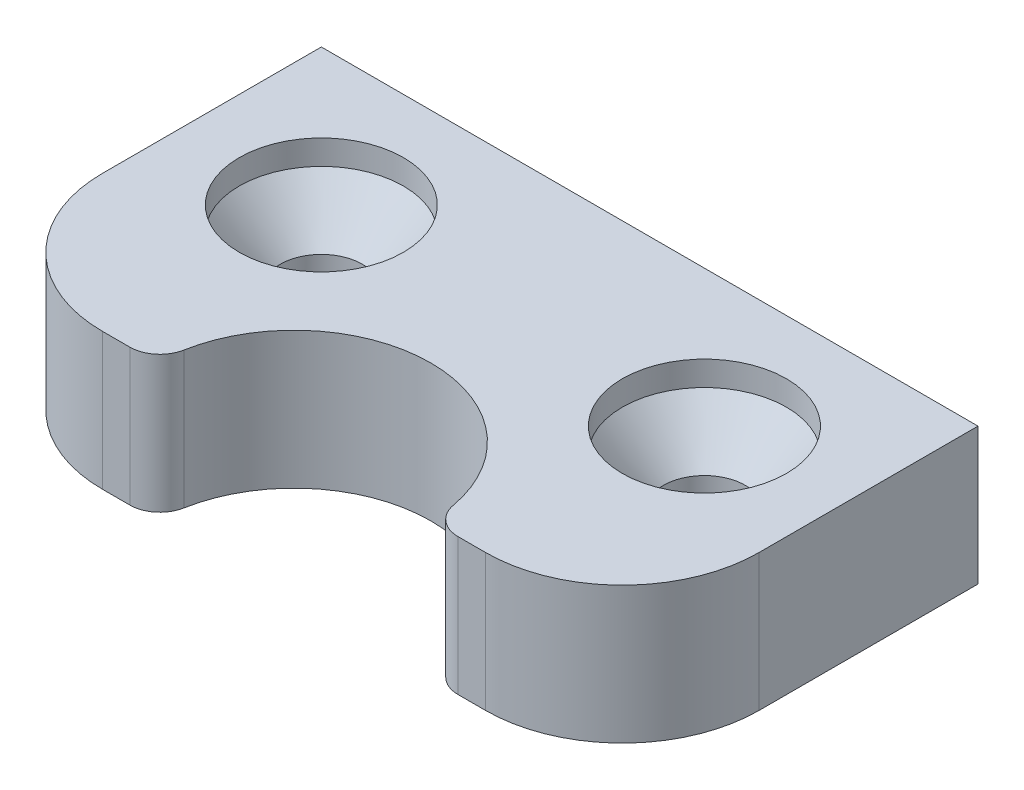
ISO-10303-21;
HEADER;
FILE_DESCRIPTION(('STEP AP214'),'2;1');
FILE_NAME('part.step','',(''),(''),'','','');
FILE_SCHEMA(('AUTOMOTIVE_DESIGN { 1 0 10303 214 1 1 1 1 }'));
ENDSEC;
DATA;
#1=APPLICATION_CONTEXT('core data for automotive mechanical design processes');
#2=APPLICATION_PROTOCOL_DEFINITION('international standard','automotive_design',2000,#1);
#3=PRODUCT_CONTEXT('',#1,'mechanical');
#4=PRODUCT('Part','Part','',(#3));
#5=PRODUCT_RELATED_PRODUCT_CATEGORY('part','',(#4));
#6=PRODUCT_DEFINITION_FORMATION('','',#4);
#7=PRODUCT_DEFINITION_CONTEXT('part definition',#1,'design');
#8=PRODUCT_DEFINITION('design','',#6,#7);
#9=PRODUCT_DEFINITION_SHAPE('','',#8);
#10=(LENGTH_UNIT() NAMED_UNIT(*) SI_UNIT(.MILLI.,.METRE.));
#11=(NAMED_UNIT(*) PLANE_ANGLE_UNIT() SI_UNIT($,.RADIAN.));
#12=(NAMED_UNIT(*) SI_UNIT($,.STERADIAN.) SOLID_ANGLE_UNIT());
#13=UNCERTAINTY_MEASURE_WITH_UNIT(LENGTH_MEASURE(1.E-05),#10,'distance_accuracy_value','');
#14=(GEOMETRIC_REPRESENTATION_CONTEXT(3) GLOBAL_UNCERTAINTY_ASSIGNED_CONTEXT((#13)) GLOBAL_UNIT_ASSIGNED_CONTEXT((#10,
#11,#12)) REPRESENTATION_CONTEXT('',''));
#15=CARTESIAN_POINT('',(0.,0.,0.));
#16=DIRECTION('',(0.,0.,1.));
#17=DIRECTION('',(1.,0.,0.));
#18=AXIS2_PLACEMENT_3D('',#15,#16,#17);
#19=CARTESIAN_POINT('',(0.,6.35,0.));
#20=DIRECTION('',(0.,0.,-1.));
#21=DIRECTION('',(-1.,0.,0.));
#22=AXIS2_PLACEMENT_3D('',#19,#20,#21);
#23=PLANE('',#22);
#24=DIRECTION('',(1.,0.,0.));
#25=VECTOR('',#24,1.);
#26=CARTESIAN_POINT('',(0.,0.,0.));
#27=LINE('',#26,#25);
#28=CARTESIAN_POINT('',(6.35,0.,0.));
#29=VERTEX_POINT('',#28);
#30=CARTESIAN_POINT('',(7.61999999999999,0.,0.));
#31=VERTEX_POINT('',#30);
#32=EDGE_CURVE('E158',#29,#31,#27,.T.);
#33=ORIENTED_EDGE('',*,*,#32,.T.);
#34=DIRECTION('',(0.,1.,0.));
#35=VECTOR('',#34,1.);
#36=CARTESIAN_POINT('',(7.61999999999999,6.35,0.));
#37=LINE('',#36,#35);
#38=CARTESIAN_POINT('',(7.61999999999999,6.35,0.));
#39=VERTEX_POINT('',#38);
#40=EDGE_CURVE('E11',#31,#39,#37,.T.);
#41=ORIENTED_EDGE('',*,*,#40,.T.);
#42=DIRECTION('',(1.,0.,0.));
#43=VECTOR('',#42,1.);
#44=CARTESIAN_POINT('',(0.,6.35,0.));
#45=LINE('',#44,#43);
#46=CARTESIAN_POINT('',(6.35,6.35,0.));
#47=VERTEX_POINT('',#46);
#48=EDGE_CURVE('E129',#47,#39,#45,.T.);
#49=ORIENTED_EDGE('',*,*,#48,.F.);
#50=DIRECTION('',(0.,-1.,0.));
#51=VECTOR('',#50,1.);
#52=CARTESIAN_POINT('',(6.35,6.35,0.));
#53=LINE('',#52,#51);
#54=EDGE_CURVE('E171',#47,#29,#53,.T.);
#55=ORIENTED_EDGE('',*,*,#54,.T.);
#56=EDGE_LOOP('',(#33,#41,#49,#55));
#57=FACE_BOUND('',#56,.T.);
#58=ADVANCED_FACE('F40',(#57),#23,.F.);
#59=CARTESIAN_POINT('',(0.,6.35,0.));
#60=DIRECTION('',(1.,0.,0.));
#61=DIRECTION('',(0.,0.,-1.));
#62=AXIS2_PLACEMENT_3D('',#59,#60,#61);
#63=PLANE('',#62);
#64=DIRECTION('',(0.,0.,1.));
#65=VECTOR('',#64,1.);
#66=CARTESIAN_POINT('',(0.,0.,0.));
#67=LINE('',#66,#65);
#68=CARTESIAN_POINT('',(0.,0.,-16.51));
#69=VERTEX_POINT('',#68);
#70=CARTESIAN_POINT('',(0.,0.,-6.35));
#71=VERTEX_POINT('',#70);
#72=EDGE_CURVE('E152',#69,#71,#67,.T.);
#73=ORIENTED_EDGE('',*,*,#72,.T.);
#74=DIRECTION('',(0.,-1.,0.));
#75=VECTOR('',#74,1.);
#76=CARTESIAN_POINT('',(0.,6.35,-6.35));
#77=LINE('',#76,#75);
#78=CARTESIAN_POINT('',(0.,6.35,-6.35));
#79=VERTEX_POINT('',#78);
#80=EDGE_CURVE('E182',#71,#79,#77,.F.);
#81=ORIENTED_EDGE('',*,*,#80,.T.);
#82=DIRECTION('',(0.,0.,1.));
#83=VECTOR('',#82,1.);
#84=CARTESIAN_POINT('',(0.,6.35,0.));
#85=LINE('',#84,#83);
#86=CARTESIAN_POINT('',(0.,6.35,-16.51));
#87=VERTEX_POINT('',#86);
#88=EDGE_CURVE('E166',#87,#79,#85,.T.);
#89=ORIENTED_EDGE('',*,*,#88,.F.);
#90=DIRECTION('',(0.,-1.,0.));
#91=VECTOR('',#90,1.);
#92=CARTESIAN_POINT('',(0.,6.35,-16.51));
#93=LINE('',#92,#91);
#94=EDGE_CURVE('E140',#87,#69,#93,.T.);
#95=ORIENTED_EDGE('',*,*,#94,.T.);
#96=EDGE_LOOP('',(#73,#81,#89,#95));
#97=FACE_BOUND('',#96,.T.);
#98=ADVANCED_FACE('F244',(#97),#63,.F.);
#99=CARTESIAN_POINT('',(22.86,6.35,0.));
#100=VERTEX_POINT('',#99);
#101=CARTESIAN_POINT('',(24.13,6.35,0.));
#102=VERTEX_POINT('',#101);
#103=EDGE_CURVE('E218',#100,#102,#45,.T.);
#104=ORIENTED_EDGE('',*,*,#103,.F.);
#105=DIRECTION('',(0.,1.,0.));
#106=VECTOR('',#105,1.);
#107=CARTESIAN_POINT('',(22.86,6.35,0.));
#108=LINE('',#107,#106);
#109=CARTESIAN_POINT('',(22.86,0.,0.));
#110=VERTEX_POINT('',#109);
#111=EDGE_CURVE('E197',#100,#110,#108,.F.);
#112=ORIENTED_EDGE('',*,*,#111,.T.);
#113=CARTESIAN_POINT('',(24.13,0.,0.));
#114=VERTEX_POINT('',#113);
#115=EDGE_CURVE('E156',#110,#114,#27,.T.);
#116=ORIENTED_EDGE('',*,*,#115,.T.);
#117=DIRECTION('',(0.,-1.,0.));
#118=VECTOR('',#117,1.);
#119=CARTESIAN_POINT('',(24.13,6.35,0.));
#120=LINE('',#119,#118);
#121=EDGE_CURVE('E139',#114,#102,#120,.F.);
#122=ORIENTED_EDGE('',*,*,#121,.T.);
#123=EDGE_LOOP('',(#104,#112,#116,#122));
#124=FACE_BOUND('',#123,.T.);
#125=ADVANCED_FACE('F223',(#124),#23,.F.);
#126=CARTESIAN_POINT('',(30.48,6.35,0.));
#127=DIRECTION('',(-1.,0.,0.));
#128=DIRECTION('',(0.,0.,1.));
#129=AXIS2_PLACEMENT_3D('',#126,#127,#128);
#130=PLANE('',#129);
#131=DIRECTION('',(0.,0.,-1.));
#132=VECTOR('',#131,1.);
#133=CARTESIAN_POINT('',(30.48,6.35,0.));
#134=LINE('',#133,#132);
#135=CARTESIAN_POINT('',(30.48,6.35,-6.35));
#136=VERTEX_POINT('',#135);
#137=CARTESIAN_POINT('',(30.48,6.35,-16.51));
#138=VERTEX_POINT('',#137);
#139=EDGE_CURVE('E116',#136,#138,#134,.T.);
#140=ORIENTED_EDGE('',*,*,#139,.F.);
#141=DIRECTION('',(0.,-1.,0.));
#142=VECTOR('',#141,1.);
#143=CARTESIAN_POINT('',(30.48,6.35,-6.35));
#144=LINE('',#143,#142);
#145=CARTESIAN_POINT('',(30.48,0.,-6.35));
#146=VERTEX_POINT('',#145);
#147=EDGE_CURVE('E190',#136,#146,#144,.T.);
#148=ORIENTED_EDGE('',*,*,#147,.T.);
#149=DIRECTION('',(0.,0.,-1.));
#150=VECTOR('',#149,1.);
#151=CARTESIAN_POINT('',(30.48,0.,0.));
#152=LINE('',#151,#150);
#153=CARTESIAN_POINT('',(30.48,0.,-16.51));
#154=VERTEX_POINT('',#153);
#155=EDGE_CURVE('E135',#146,#154,#152,.T.);
#156=ORIENTED_EDGE('',*,*,#155,.T.);
#157=DIRECTION('',(0.,-1.,0.));
#158=VECTOR('',#157,1.);
#159=CARTESIAN_POINT('',(30.48,6.35,-16.51));
#160=LINE('',#159,#158);
#161=EDGE_CURVE('E132',#138,#154,#160,.T.);
#162=ORIENTED_EDGE('',*,*,#161,.F.);
#163=EDGE_LOOP('',(#140,#148,#156,#162));
#164=FACE_BOUND('',#163,.T.);
#165=ADVANCED_FACE('F133',(#164),#130,.F.);
#166=CARTESIAN_POINT('',(0.,6.35,-16.51));
#167=DIRECTION('',(0.,0.,1.));
#168=DIRECTION('',(1.,0.,0.));
#169=AXIS2_PLACEMENT_3D('',#166,#167,#168);
#170=PLANE('',#169);
#171=DIRECTION('',(-1.,0.,0.));
#172=VECTOR('',#171,1.);
#173=CARTESIAN_POINT('',(0.,0.,-16.51));
#174=LINE('',#173,#172);
#175=EDGE_CURVE('E164',#154,#69,#174,.T.);
#176=ORIENTED_EDGE('',*,*,#175,.T.);
#177=ORIENTED_EDGE('',*,*,#94,.F.);
#178=DIRECTION('',(-1.,0.,0.));
#179=VECTOR('',#178,1.);
#180=CARTESIAN_POINT('',(0.,6.35,-16.51));
#181=LINE('',#180,#179);
#182=EDGE_CURVE('E121',#138,#87,#181,.T.);
#183=ORIENTED_EDGE('',*,*,#182,.F.);
#184=ORIENTED_EDGE('',*,*,#161,.T.);
#185=EDGE_LOOP('',(#176,#177,#183,#184));
#186=FACE_BOUND('',#185,.T.);
#187=ADVANCED_FACE('F142',(#186),#170,.F.);
#188=CARTESIAN_POINT('',(0.,6.35,0.));
#189=DIRECTION('',(0.,-1.,0.));
#190=DIRECTION('',(0.,0.,-1.));
#191=AXIS2_PLACEMENT_3D('',#188,#189,#190);
#192=PLANE('',#191);
#193=CARTESIAN_POINT('',(6.35,6.35,-10.16));
#194=DIRECTION('',(0.,1.,0.));
#195=DIRECTION('',(0.,0.,1.));
#196=AXIS2_PLACEMENT_3D('',#193,#194,#195);
#197=CIRCLE('',#196,3.81);
#198=CARTESIAN_POINT('',(6.35,6.35,-6.35));
#199=VERTEX_POINT('',#198);
#200=EDGE_CURVE('E255',#199,#199,#197,.T.);
#201=ORIENTED_EDGE('',*,*,#200,.F.);
#202=EDGE_LOOP('',(#201));
#203=FACE_BOUND('',#202,.T.);
#204=CARTESIAN_POINT('',(24.13,6.35,-10.16));
#205=DIRECTION('',(0.,1.,0.));
#206=DIRECTION('',(0.,0.,1.));
#207=AXIS2_PLACEMENT_3D('',#204,#205,#206);
#208=CIRCLE('',#207,3.81);
#209=CARTESIAN_POINT('',(24.13,6.35,-6.35));
#210=VERTEX_POINT('',#209);
#211=EDGE_CURVE('E256',#210,#210,#208,.T.);
#212=ORIENTED_EDGE('',*,*,#211,.F.);
#213=EDGE_LOOP('',(#212));
#214=FACE_BOUND('',#213,.T.);
#215=CARTESIAN_POINT('',(15.24,6.35,0.));
#216=DIRECTION('',(0.,1.,0.));
#217=DIRECTION('',(0.,0.,1.));
#218=AXIS2_PLACEMENT_3D('',#215,#216,#217);
#219=CIRCLE('',#218,6.35);
#220=CARTESIAN_POINT('',(21.4859016393443,6.35,-1.14508196721311));
#221=VERTEX_POINT('',#220);
#222=CARTESIAN_POINT('',(8.99409836065573,6.35,-1.14508196721311));
#223=VERTEX_POINT('',#222);
#224=EDGE_CURVE('E157',#221,#223,#219,.T.);
#225=ORIENTED_EDGE('',*,*,#224,.F.);
#226=CARTESIAN_POINT('',(22.86,6.35,-1.397));
#227=DIRECTION('',(0.,-1.,0.));
#228=DIRECTION('',(0.,0.,-1.));
#229=AXIS2_PLACEMENT_3D('',#226,#227,#228);
#230=CIRCLE('',#229,1.397);
#231=EDGE_CURVE('E49',#221,#100,#230,.F.);
#232=ORIENTED_EDGE('',*,*,#231,.T.);
#233=ORIENTED_EDGE('',*,*,#103,.T.);
#234=CARTESIAN_POINT('',(24.13,6.35,-6.35));
#235=DIRECTION('',(0.,-1.,0.));
#236=DIRECTION('',(0.,0.,-1.));
#237=AXIS2_PLACEMENT_3D('',#234,#235,#236);
#238=CIRCLE('',#237,6.35);
#239=EDGE_CURVE('E124',#102,#136,#238,.F.);
#240=ORIENTED_EDGE('',*,*,#239,.T.);
#241=ORIENTED_EDGE('',*,*,#139,.T.);
#242=ORIENTED_EDGE('',*,*,#182,.T.);
#243=ORIENTED_EDGE('',*,*,#88,.T.);
#244=CARTESIAN_POINT('',(6.35,6.35,-6.35));
#245=DIRECTION('',(0.,-1.,0.));
#246=DIRECTION('',(0.,0.,-1.));
#247=AXIS2_PLACEMENT_3D('',#244,#245,#246);
#248=CIRCLE('',#247,6.35);
#249=EDGE_CURVE('E187',#79,#47,#248,.F.);
#250=ORIENTED_EDGE('',*,*,#249,.T.);
#251=ORIENTED_EDGE('',*,*,#48,.T.);
#252=CARTESIAN_POINT('',(7.61999999999999,6.35,-1.397));
#253=DIRECTION('',(0.,-1.,0.));
#254=DIRECTION('',(0.,0.,-1.));
#255=AXIS2_PLACEMENT_3D('',#252,#253,#254);
#256=CIRCLE('',#255,1.397);
#257=EDGE_CURVE('E56',#39,#223,#256,.F.);
#258=ORIENTED_EDGE('',*,*,#257,.T.);
#259=EDGE_LOOP('',(#225,#232,#233,#240,#241,#242,#243,#250,#251,#258));
#260=FACE_BOUND('',#259,.T.);
#261=ADVANCED_FACE('F118',(#203,#214,#260),#192,.F.);
#262=CARTESIAN_POINT('',(0.,0.,0.));
#263=DIRECTION('',(0.,-1.,0.));
#264=DIRECTION('',(0.,0.,-1.));
#265=AXIS2_PLACEMENT_3D('',#262,#263,#264);
#266=PLANE('',#265);
#267=CARTESIAN_POINT('',(15.24,0.,-10.16));
#268=DIRECTION('',(0.,-1.,0.));
#269=DIRECTION('',(0.,0.,-1.));
#270=AXIS2_PLACEMENT_3D('',#267,#268,#269);
#271=CIRCLE('',#270,2.54);
#272=CARTESIAN_POINT('',(15.24,0.,-12.7));
#273=VERTEX_POINT('',#272);
#274=EDGE_CURVE('E288',#273,#273,#271,.T.);
#275=ORIENTED_EDGE('',*,*,#274,.F.);
#276=EDGE_LOOP('',(#275));
#277=FACE_BOUND('',#276,.T.);
#278=CARTESIAN_POINT('',(6.35,0.,-10.16));
#279=DIRECTION('',(0.,1.,0.));
#280=DIRECTION('',(0.,0.,1.));
#281=AXIS2_PLACEMENT_3D('',#278,#279,#280);
#282=CIRCLE('',#281,1.905);
#283=CARTESIAN_POINT('',(6.35,0.,-8.255));
#284=VERTEX_POINT('',#283);
#285=EDGE_CURVE('E275',#284,#284,#282,.T.);
#286=ORIENTED_EDGE('',*,*,#285,.T.);
#287=EDGE_LOOP('',(#286));
#288=FACE_BOUND('',#287,.T.);
#289=CARTESIAN_POINT('',(24.13,0.,-10.16));
#290=DIRECTION('',(0.,1.,0.));
#291=DIRECTION('',(0.,0.,1.));
#292=AXIS2_PLACEMENT_3D('',#289,#290,#291);
#293=CIRCLE('',#292,1.905);
#294=CARTESIAN_POINT('',(24.13,0.,-8.255));
#295=VERTEX_POINT('',#294);
#296=EDGE_CURVE('E260',#295,#295,#293,.T.);
#297=ORIENTED_EDGE('',*,*,#296,.T.);
#298=EDGE_LOOP('',(#297));
#299=FACE_BOUND('',#298,.T.);
#300=ORIENTED_EDGE('',*,*,#115,.F.);
#301=CARTESIAN_POINT('',(22.86,0.,-1.397));
#302=DIRECTION('',(0.,-1.,0.));
#303=DIRECTION('',(0.,0.,-1.));
#304=AXIS2_PLACEMENT_3D('',#301,#302,#303);
#305=CIRCLE('',#304,1.397);
#306=CARTESIAN_POINT('',(21.4859016393443,0.,-1.14508196721311));
#307=VERTEX_POINT('',#306);
#308=EDGE_CURVE('E204',#110,#307,#305,.T.);
#309=ORIENTED_EDGE('',*,*,#308,.T.);
#310=CARTESIAN_POINT('',(15.24,0.,0.));
#311=DIRECTION('',(0.,-1.,0.));
#312=DIRECTION('',(0.,0.,-1.));
#313=AXIS2_PLACEMENT_3D('',#310,#311,#312);
#314=CIRCLE('',#313,6.35);
#315=CARTESIAN_POINT('',(8.99409836065573,0.,-1.14508196721311));
#316=VERTEX_POINT('',#315);
#317=EDGE_CURVE('E193',#316,#307,#314,.T.);
#318=ORIENTED_EDGE('',*,*,#317,.F.);
#319=CARTESIAN_POINT('',(7.61999999999999,0.,-1.397));
#320=DIRECTION('',(0.,-1.,0.));
#321=DIRECTION('',(0.,0.,-1.));
#322=AXIS2_PLACEMENT_3D('',#319,#320,#321);
#323=CIRCLE('',#322,1.397);
#324=EDGE_CURVE('E201',#316,#31,#323,.T.);
#325=ORIENTED_EDGE('',*,*,#324,.T.);
#326=ORIENTED_EDGE('',*,*,#32,.F.);
#327=CARTESIAN_POINT('',(6.35,0.,-6.35));
#328=DIRECTION('',(0.,-1.,0.));
#329=DIRECTION('',(0.,0.,-1.));
#330=AXIS2_PLACEMENT_3D('',#327,#328,#329);
#331=CIRCLE('',#330,6.35);
#332=EDGE_CURVE('E179',#29,#71,#331,.T.);
#333=ORIENTED_EDGE('',*,*,#332,.T.);
#334=ORIENTED_EDGE('',*,*,#72,.F.);
#335=ORIENTED_EDGE('',*,*,#175,.F.);
#336=ORIENTED_EDGE('',*,*,#155,.F.);
#337=CARTESIAN_POINT('',(24.13,0.,-6.35));
#338=DIRECTION('',(0.,-1.,0.));
#339=DIRECTION('',(0.,0.,-1.));
#340=AXIS2_PLACEMENT_3D('',#337,#338,#339);
#341=CIRCLE('',#340,6.35);
#342=EDGE_CURVE('E175',#146,#114,#341,.T.);
#343=ORIENTED_EDGE('',*,*,#342,.T.);
#344=EDGE_LOOP('',(#300,#309,#318,#325,#326,#333,#334,#335,#336,#343));
#345=FACE_BOUND('',#344,.T.);
#346=ADVANCED_FACE('F230',(#277,#288,#299,#345),#266,.T.);
#347=CARTESIAN_POINT('',(6.35,6.35,-6.35));
#348=DIRECTION('',(0.,-1.,0.));
#349=DIRECTION('',(0.,0.,-1.));
#350=AXIS2_PLACEMENT_3D('',#347,#348,#349);
#351=CYLINDRICAL_SURFACE('',#350,6.35);
#352=ORIENTED_EDGE('',*,*,#249,.F.);
#353=ORIENTED_EDGE('',*,*,#80,.F.);
#354=ORIENTED_EDGE('',*,*,#332,.F.);
#355=ORIENTED_EDGE('',*,*,#54,.F.);
#356=EDGE_LOOP('',(#352,#353,#354,#355));
#357=FACE_BOUND('',#356,.T.);
#358=ADVANCED_FACE('F240',(#357),#351,.T.);
#359=CARTESIAN_POINT('',(24.13,6.35,-6.35));
#360=DIRECTION('',(0.,-1.,0.));
#361=DIRECTION('',(0.,0.,-1.));
#362=AXIS2_PLACEMENT_3D('',#359,#360,#361);
#363=CYLINDRICAL_SURFACE('',#362,6.35);
#364=ORIENTED_EDGE('',*,*,#239,.F.);
#365=ORIENTED_EDGE('',*,*,#121,.F.);
#366=ORIENTED_EDGE('',*,*,#342,.F.);
#367=ORIENTED_EDGE('',*,*,#147,.F.);
#368=EDGE_LOOP('',(#364,#365,#366,#367));
#369=FACE_BOUND('',#368,.T.);
#370=ADVANCED_FACE('F383',(#369),#363,.T.);
#371=CARTESIAN_POINT('',(15.24,-6.35,0.));
#372=DIRECTION('',(0.,1.,0.));
#373=DIRECTION('',(0.,0.,1.));
#374=AXIS2_PLACEMENT_3D('',#371,#372,#373);
#375=CYLINDRICAL_SURFACE('',#374,6.35);
#376=ORIENTED_EDGE('',*,*,#317,.T.);
#377=DIRECTION('',(0.,1.,0.));
#378=VECTOR('',#377,1.);
#379=CARTESIAN_POINT('',(21.4859016393443,-6.35,-1.14508196721311));
#380=LINE('',#379,#378);
#381=EDGE_CURVE('E210',#307,#221,#380,.T.);
#382=ORIENTED_EDGE('',*,*,#381,.T.);
#383=ORIENTED_EDGE('',*,*,#224,.T.);
#384=DIRECTION('',(0.,1.,0.));
#385=VECTOR('',#384,1.);
#386=CARTESIAN_POINT('',(8.99409836065573,-6.35,-1.14508196721312));
#387=LINE('',#386,#385);
#388=EDGE_CURVE('E207',#223,#316,#387,.F.);
#389=ORIENTED_EDGE('',*,*,#388,.T.);
#390=EDGE_LOOP('',(#376,#382,#383,#389));
#391=FACE_BOUND('',#390,.T.);
#392=ADVANCED_FACE('F233',(#391),#375,.F.);
#393=CARTESIAN_POINT('',(22.86,-6.35,-1.397));
#394=DIRECTION('',(0.,1.,0.));
#395=DIRECTION('',(0.,0.,1.));
#396=AXIS2_PLACEMENT_3D('',#393,#394,#395);
#397=CYLINDRICAL_SURFACE('',#396,1.397);
#398=ORIENTED_EDGE('',*,*,#231,.F.);
#399=ORIENTED_EDGE('',*,*,#381,.F.);
#400=ORIENTED_EDGE('',*,*,#308,.F.);
#401=ORIENTED_EDGE('',*,*,#111,.F.);
#402=EDGE_LOOP('',(#398,#399,#400,#401));
#403=FACE_BOUND('',#402,.T.);
#404=ADVANCED_FACE('F227',(#403),#397,.T.);
#405=CARTESIAN_POINT('',(7.61999999999999,-6.35,-1.397));
#406=DIRECTION('',(0.,1.,0.));
#407=DIRECTION('',(0.,0.,1.));
#408=AXIS2_PLACEMENT_3D('',#405,#406,#407);
#409=CYLINDRICAL_SURFACE('',#408,1.397);
#410=ORIENTED_EDGE('',*,*,#324,.F.);
#411=ORIENTED_EDGE('',*,*,#388,.F.);
#412=ORIENTED_EDGE('',*,*,#257,.F.);
#413=ORIENTED_EDGE('',*,*,#40,.F.);
#414=EDGE_LOOP('',(#410,#411,#412,#413));
#415=FACE_BOUND('',#414,.T.);
#416=ADVANCED_FACE('F42',(#415),#409,.T.);
#417=CARTESIAN_POINT('',(24.13,5.207,-10.16));
#418=DIRECTION('',(0.,1.,0.));
#419=DIRECTION('',(0.,0.,1.));
#420=AXIS2_PLACEMENT_3D('',#417,#418,#419);
#421=CYLINDRICAL_SURFACE('',#420,3.81);
#422=CARTESIAN_POINT('',(24.13,5.207,-10.16));
#423=DIRECTION('',(0.,1.,0.));
#424=DIRECTION('',(0.,0.,1.));
#425=AXIS2_PLACEMENT_3D('',#422,#423,#424);
#426=CIRCLE('',#425,3.81);
#427=CARTESIAN_POINT('',(24.13,5.207,-6.35));
#428=VERTEX_POINT('',#427);
#429=EDGE_CURVE('E271',#428,#428,#426,.T.);
#430=ORIENTED_EDGE('',*,*,#429,.F.);
#431=EDGE_LOOP('',(#430));
#432=FACE_BOUND('',#431,.T.);
#433=ORIENTED_EDGE('',*,*,#211,.T.);
#434=EDGE_LOOP('',(#433));
#435=FACE_BOUND('',#434,.T.);
#436=ADVANCED_FACE('F327',(#432,#435),#421,.F.);
#437=CARTESIAN_POINT('',(6.35,5.207,-10.16));
#438=DIRECTION('',(0.,1.,0.));
#439=DIRECTION('',(0.,0.,1.));
#440=AXIS2_PLACEMENT_3D('',#437,#438,#439);
#441=CYLINDRICAL_SURFACE('',#440,3.81);
#442=CARTESIAN_POINT('',(6.35,5.207,-10.16));
#443=DIRECTION('',(0.,1.,0.));
#444=DIRECTION('',(0.,0.,1.));
#445=AXIS2_PLACEMENT_3D('',#442,#443,#444);
#446=CIRCLE('',#445,3.81);
#447=CARTESIAN_POINT('',(6.35,5.207,-6.35));
#448=VERTEX_POINT('',#447);
#449=EDGE_CURVE('E283',#448,#448,#446,.T.);
#450=ORIENTED_EDGE('',*,*,#449,.F.);
#451=EDGE_LOOP('',(#450));
#452=FACE_BOUND('',#451,.T.);
#453=ORIENTED_EDGE('',*,*,#200,.T.);
#454=EDGE_LOOP('',(#453));
#455=FACE_BOUND('',#454,.T.);
#456=ADVANCED_FACE('F317',(#452,#455),#441,.F.);
#457=CARTESIAN_POINT('',(24.13,5.207,-10.16));
#458=DIRECTION('',(0.,1.,0.));
#459=DIRECTION('',(0.,0.,1.));
#460=AXIS2_PLACEMENT_3D('',#457,#458,#459);
#461=CYLINDRICAL_SURFACE('',#460,1.905);
#462=ORIENTED_EDGE('',*,*,#296,.F.);
#463=EDGE_LOOP('',(#462));
#464=FACE_BOUND('',#463,.T.);
#465=CARTESIAN_POINT('',(24.13,3.01554818424398,-10.16));
#466=DIRECTION('',(0.,1.,0.));
#467=DIRECTION('',(0.,0.,1.));
#468=AXIS2_PLACEMENT_3D('',#465,#466,#467);
#469=CIRCLE('',#468,1.905);
#470=CARTESIAN_POINT('',(24.13,3.01554818424398,-8.255));
#471=VERTEX_POINT('',#470);
#472=EDGE_CURVE('E267',#471,#471,#469,.T.);
#473=ORIENTED_EDGE('',*,*,#472,.T.);
#474=EDGE_LOOP('',(#473));
#475=FACE_BOUND('',#474,.T.);
#476=ADVANCED_FACE('F313',(#464,#475),#461,.F.);
#477=CARTESIAN_POINT('',(24.13,5.207,-10.16));
#478=DIRECTION('',(0.,1.,0.));
#479=DIRECTION('',(0.,0.,1.));
#480=AXIS2_PLACEMENT_3D('',#477,#478,#479);
#481=CONICAL_SURFACE('',#480,3.81,0.715584993317675);
#482=ORIENTED_EDGE('',*,*,#472,.F.);
#483=EDGE_LOOP('',(#482));
#484=FACE_BOUND('',#483,.T.);
#485=ORIENTED_EDGE('',*,*,#429,.T.);
#486=EDGE_LOOP('',(#485));
#487=FACE_BOUND('',#486,.T.);
#488=ADVANCED_FACE('F316',(#484,#487),#481,.F.);
#489=CARTESIAN_POINT('',(6.35,5.207,-10.16));
#490=DIRECTION('',(0.,1.,0.));
#491=DIRECTION('',(0.,0.,1.));
#492=AXIS2_PLACEMENT_3D('',#489,#490,#491);
#493=CYLINDRICAL_SURFACE('',#492,1.905);
#494=ORIENTED_EDGE('',*,*,#285,.F.);
#495=EDGE_LOOP('',(#494));
#496=FACE_BOUND('',#495,.T.);
#497=CARTESIAN_POINT('',(6.35,3.01554818424398,-10.16));
#498=DIRECTION('',(0.,1.,0.));
#499=DIRECTION('',(0.,0.,1.));
#500=AXIS2_PLACEMENT_3D('',#497,#498,#499);
#501=CIRCLE('',#500,1.905);
#502=CARTESIAN_POINT('',(6.35,3.01554818424398,-8.255));
#503=VERTEX_POINT('',#502);
#504=EDGE_CURVE('E279',#503,#503,#501,.T.);
#505=ORIENTED_EDGE('',*,*,#504,.T.);
#506=EDGE_LOOP('',(#505));
#507=FACE_BOUND('',#506,.T.);
#508=ADVANCED_FACE('F323',(#496,#507),#493,.F.);
#509=CARTESIAN_POINT('',(6.35,5.207,-10.16));
#510=DIRECTION('',(0.,1.,0.));
#511=DIRECTION('',(0.,0.,1.));
#512=AXIS2_PLACEMENT_3D('',#509,#510,#511);
#513=CONICAL_SURFACE('',#512,3.81,0.715584993317675);
#514=ORIENTED_EDGE('',*,*,#504,.F.);
#515=EDGE_LOOP('',(#514));
#516=FACE_BOUND('',#515,.T.);
#517=ORIENTED_EDGE('',*,*,#449,.T.);
#518=EDGE_LOOP('',(#517));
#519=FACE_BOUND('',#518,.T.);
#520=ADVANCED_FACE('F302',(#516,#519),#513,.F.);
#521=CARTESIAN_POINT('',(15.24,5.08,-10.16));
#522=DIRECTION('',(0.,-1.,0.));
#523=DIRECTION('',(0.,0.,-1.));
#524=AXIS2_PLACEMENT_3D('',#521,#522,#523);
#525=CYLINDRICAL_SURFACE('',#524,2.54);
#526=CARTESIAN_POINT('',(15.24,5.08,-10.16));
#527=DIRECTION('',(0.,-1.,0.));
#528=DIRECTION('',(0.,0.,-1.));
#529=AXIS2_PLACEMENT_3D('',#526,#527,#528);
#530=CIRCLE('',#529,2.54);
#531=CARTESIAN_POINT('',(15.24,5.08,-12.7));
#532=VERTEX_POINT('',#531);
#533=EDGE_CURVE('E287',#532,#532,#530,.T.);
#534=ORIENTED_EDGE('',*,*,#533,.F.);
#535=EDGE_LOOP('',(#534));
#536=FACE_BOUND('',#535,.T.);
#537=ORIENTED_EDGE('',*,*,#274,.T.);
#538=EDGE_LOOP('',(#537));
#539=FACE_BOUND('',#538,.T.);
#540=ADVANCED_FACE('F299',(#536,#539),#525,.F.);
#541=CARTESIAN_POINT('',(15.24,5.08,-10.16));
#542=DIRECTION('',(0.,-1.,0.));
#543=DIRECTION('',(0.,0.,-1.));
#544=AXIS2_PLACEMENT_3D('',#541,#542,#543);
#545=PLANE('',#544);
#546=ORIENTED_EDGE('',*,*,#533,.T.);
#547=EDGE_LOOP('',(#546));
#548=FACE_BOUND('',#547,.T.);
#549=ADVANCED_FACE('F297',(#548),#545,.T.);
#550=CLOSED_SHELL('',(#58,#98,#125,#165,#187,#261,#346,#358,#370,#392,#404,#416,#436,#456,#476,
#488,#508,#520,#540,#549));
#551=MANIFOLD_SOLID_BREP('B2',#550);
#552=ADVANCED_BREP_SHAPE_REPRESENTATION('',(#18,#551),#14);
#553=SHAPE_DEFINITION_REPRESENTATION(#9,#552);
ENDSEC;
END-ISO-10303-21;
